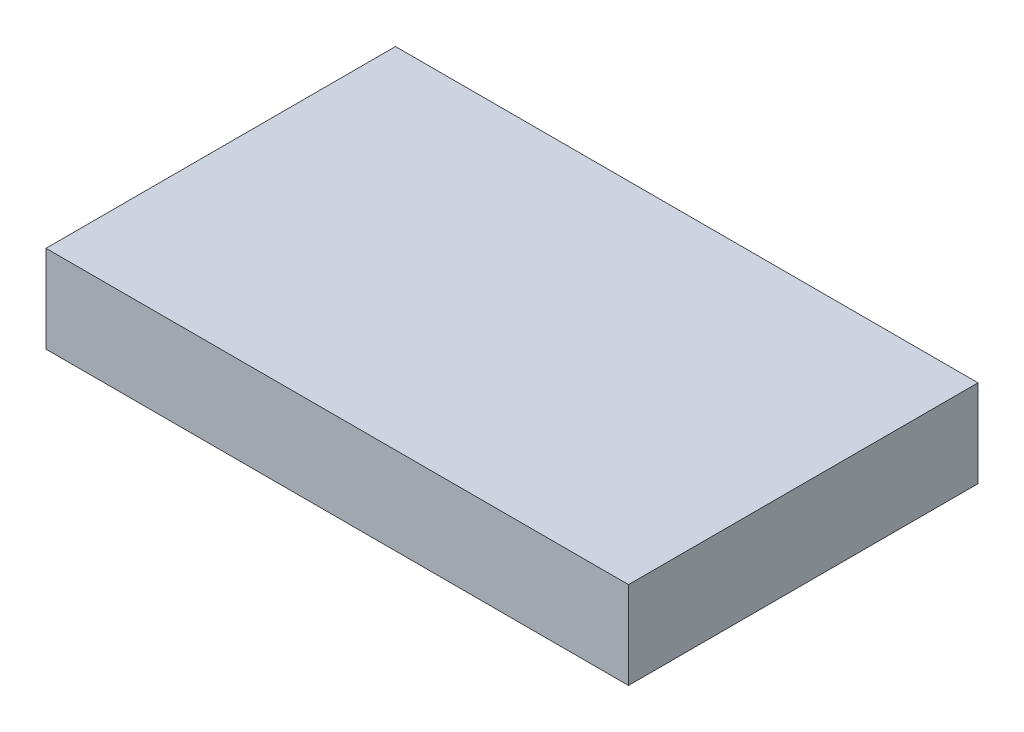
ISO-10303-21;
HEADER;
FILE_DESCRIPTION(('STEP AP214'),'2;1');
FILE_NAME('part.step','',(''),(''),'','','');
FILE_SCHEMA(('AUTOMOTIVE_DESIGN { 1 0 10303 214 1 1 1 1 }'));
ENDSEC;
DATA;
#1=APPLICATION_CONTEXT('core data for automotive mechanical design processes');
#2=APPLICATION_PROTOCOL_DEFINITION('international standard','automotive_design',2000,#1);
#3=PRODUCT_CONTEXT('',#1,'mechanical');
#4=PRODUCT('Part','Part','',(#3));
#5=PRODUCT_RELATED_PRODUCT_CATEGORY('part','',(#4));
#6=PRODUCT_DEFINITION_FORMATION('','',#4);
#7=PRODUCT_DEFINITION_CONTEXT('part definition',#1,'design');
#8=PRODUCT_DEFINITION('design','',#6,#7);
#9=PRODUCT_DEFINITION_SHAPE('','',#8);
#10=(LENGTH_UNIT() NAMED_UNIT(*) SI_UNIT(.MILLI.,.METRE.));
#11=(NAMED_UNIT(*) PLANE_ANGLE_UNIT() SI_UNIT($,.RADIAN.));
#12=(NAMED_UNIT(*) SI_UNIT($,.STERADIAN.) SOLID_ANGLE_UNIT());
#13=UNCERTAINTY_MEASURE_WITH_UNIT(LENGTH_MEASURE(1.E-05),#10,'distance_accuracy_value','');
#14=(GEOMETRIC_REPRESENTATION_CONTEXT(3) GLOBAL_UNCERTAINTY_ASSIGNED_CONTEXT((#13)) GLOBAL_UNIT_ASSIGNED_CONTEXT((#10,
#11,#12)) REPRESENTATION_CONTEXT('',''));
#15=CARTESIAN_POINT('',(0.,0.,0.));
#16=DIRECTION('',(0.,0.,1.));
#17=DIRECTION('',(1.,0.,0.));
#18=AXIS2_PLACEMENT_3D('',#15,#16,#17);
#19=CARTESIAN_POINT('',(-40.,12.,48.));
#20=DIRECTION('',(1.,0.,0.));
#21=DIRECTION('',(0.,0.,-1.));
#22=AXIS2_PLACEMENT_3D('',#19,#20,#21);
#23=PLANE('',#22);
#24=DIRECTION('',(0.,-1.,0.));
#25=VECTOR('',#24,1.);
#26=CARTESIAN_POINT('',(-40.,12.,0.));
#27=LINE('',#26,#25);
#28=CARTESIAN_POINT('',(-40.,12.,0.));
#29=VERTEX_POINT('',#28);
#30=CARTESIAN_POINT('',(-40.,0.,0.));
#31=VERTEX_POINT('',#30);
#32=EDGE_CURVE('E107',#29,#31,#27,.T.);
#33=ORIENTED_EDGE('',*,*,#32,.T.);
#34=DIRECTION('',(0.,0.,-1.));
#35=VECTOR('',#34,1.);
#36=CARTESIAN_POINT('',(-40.,0.,48.));
#37=LINE('',#36,#35);
#38=CARTESIAN_POINT('',(-40.,0.,48.));
#39=VERTEX_POINT('',#38);
#40=EDGE_CURVE('E11',#39,#31,#37,.T.);
#41=ORIENTED_EDGE('',*,*,#40,.F.);
#42=DIRECTION('',(0.,-1.,0.));
#43=VECTOR('',#42,1.);
#44=CARTESIAN_POINT('',(-40.,12.,48.));
#45=LINE('',#44,#43);
#46=CARTESIAN_POINT('',(-40.,12.,48.));
#47=VERTEX_POINT('',#46);
#48=EDGE_CURVE('E91',#47,#39,#45,.T.);
#49=ORIENTED_EDGE('',*,*,#48,.F.);
#50=DIRECTION('',(0.,0.,-1.));
#51=VECTOR('',#50,1.);
#52=CARTESIAN_POINT('',(-40.,12.,48.));
#53=LINE('',#52,#51);
#54=EDGE_CURVE('E103',#47,#29,#53,.T.);
#55=ORIENTED_EDGE('',*,*,#54,.T.);
#56=EDGE_LOOP('',(#33,#41,#49,#55));
#57=FACE_BOUND('',#56,.T.);
#58=ADVANCED_FACE('F39',(#57),#23,.F.);
#59=CARTESIAN_POINT('',(-40.,0.,48.));
#60=DIRECTION('',(0.,1.,0.));
#61=DIRECTION('',(0.,0.,1.));
#62=AXIS2_PLACEMENT_3D('',#59,#60,#61);
#63=PLANE('',#62);
#64=DIRECTION('',(1.,0.,0.));
#65=VECTOR('',#64,1.);
#66=CARTESIAN_POINT('',(-40.,0.,0.));
#67=LINE('',#66,#65);
#68=CARTESIAN_POINT('',(40.,0.,0.));
#69=VERTEX_POINT('',#68);
#70=EDGE_CURVE('E96',#31,#69,#67,.T.);
#71=ORIENTED_EDGE('',*,*,#70,.T.);
#72=DIRECTION('',(0.,0.,-1.));
#73=VECTOR('',#72,1.);
#74=CARTESIAN_POINT('',(40.,0.,48.));
#75=LINE('',#74,#73);
#76=CARTESIAN_POINT('',(40.,0.,48.));
#77=VERTEX_POINT('',#76);
#78=EDGE_CURVE('E48',#77,#69,#75,.T.);
#79=ORIENTED_EDGE('',*,*,#78,.F.);
#80=DIRECTION('',(1.,0.,0.));
#81=VECTOR('',#80,1.);
#82=CARTESIAN_POINT('',(-40.,0.,48.));
#83=LINE('',#82,#81);
#84=EDGE_CURVE('E86',#39,#77,#83,.T.);
#85=ORIENTED_EDGE('',*,*,#84,.F.);
#86=ORIENTED_EDGE('',*,*,#40,.T.);
#87=EDGE_LOOP('',(#71,#79,#85,#86));
#88=FACE_BOUND('',#87,.T.);
#89=ADVANCED_FACE('F95',(#88),#63,.F.);
#90=CARTESIAN_POINT('',(40.,0.,48.));
#91=DIRECTION('',(-1.,0.,0.));
#92=DIRECTION('',(0.,0.,1.));
#93=AXIS2_PLACEMENT_3D('',#90,#91,#92);
#94=PLANE('',#93);
#95=DIRECTION('',(0.,1.,0.));
#96=VECTOR('',#95,1.);
#97=CARTESIAN_POINT('',(40.,0.,0.));
#98=LINE('',#97,#96);
#99=CARTESIAN_POINT('',(40.,12.,0.));
#100=VERTEX_POINT('',#99);
#101=EDGE_CURVE('E73',#69,#100,#98,.T.);
#102=ORIENTED_EDGE('',*,*,#101,.T.);
#103=DIRECTION('',(0.,0.,-1.));
#104=VECTOR('',#103,1.);
#105=CARTESIAN_POINT('',(40.,12.,48.));
#106=LINE('',#105,#104);
#107=CARTESIAN_POINT('',(40.,12.,48.));
#108=VERTEX_POINT('',#107);
#109=EDGE_CURVE('E98',#108,#100,#106,.T.);
#110=ORIENTED_EDGE('',*,*,#109,.F.);
#111=DIRECTION('',(0.,1.,0.));
#112=VECTOR('',#111,1.);
#113=CARTESIAN_POINT('',(40.,0.,48.));
#114=LINE('',#113,#112);
#115=EDGE_CURVE('E89',#77,#108,#114,.T.);
#116=ORIENTED_EDGE('',*,*,#115,.F.);
#117=ORIENTED_EDGE('',*,*,#78,.T.);
#118=EDGE_LOOP('',(#102,#110,#116,#117));
#119=FACE_BOUND('',#118,.T.);
#120=ADVANCED_FACE('F99',(#119),#94,.F.);
#121=CARTESIAN_POINT('',(40.,12.,48.));
#122=DIRECTION('',(0.,-1.,0.));
#123=DIRECTION('',(1.,0.,0.));
#124=AXIS2_PLACEMENT_3D('',#121,#122,#123);
#125=PLANE('',#124);
#126=DIRECTION('',(-1.,0.,0.));
#127=VECTOR('',#126,1.);
#128=CARTESIAN_POINT('',(40.,12.,0.));
#129=LINE('',#128,#127);
#130=EDGE_CURVE('E79',#100,#29,#129,.T.);
#131=ORIENTED_EDGE('',*,*,#130,.T.);
#132=ORIENTED_EDGE('',*,*,#54,.F.);
#133=DIRECTION('',(-1.,0.,0.));
#134=VECTOR('',#133,1.);
#135=CARTESIAN_POINT('',(40.,12.,48.));
#136=LINE('',#135,#134);
#137=EDGE_CURVE('E56',#108,#47,#136,.T.);
#138=ORIENTED_EDGE('',*,*,#137,.F.);
#139=ORIENTED_EDGE('',*,*,#109,.T.);
#140=EDGE_LOOP('',(#131,#132,#138,#139));
#141=FACE_BOUND('',#140,.T.);
#142=ADVANCED_FACE('F120',(#141),#125,.F.);
#143=CARTESIAN_POINT('',(0.,0.,48.));
#144=DIRECTION('',(0.,0.,1.));
#145=DIRECTION('',(1.,0.,0.));
#146=AXIS2_PLACEMENT_3D('',#143,#144,#145);
#147=PLANE('',#146);
#148=ORIENTED_EDGE('',*,*,#48,.T.);
#149=ORIENTED_EDGE('',*,*,#84,.T.);
#150=ORIENTED_EDGE('',*,*,#115,.T.);
#151=ORIENTED_EDGE('',*,*,#137,.T.);
#152=EDGE_LOOP('',(#148,#149,#150,#151));
#153=FACE_BOUND('',#152,.T.);
#154=ADVANCED_FACE('F87',(#153),#147,.T.);
#155=CARTESIAN_POINT('',(0.,0.,0.));
#156=DIRECTION('',(0.,0.,1.));
#157=DIRECTION('',(1.,0.,0.));
#158=AXIS2_PLACEMENT_3D('',#155,#156,#157);
#159=PLANE('',#158);
#160=ORIENTED_EDGE('',*,*,#32,.F.);
#161=ORIENTED_EDGE('',*,*,#130,.F.);
#162=ORIENTED_EDGE('',*,*,#101,.F.);
#163=ORIENTED_EDGE('',*,*,#70,.F.);
#164=EDGE_LOOP('',(#160,#161,#162,#163));
#165=FACE_BOUND('',#164,.T.);
#166=ADVANCED_FACE('F123',(#165),#159,.F.);
#167=CLOSED_SHELL('',(#58,#89,#120,#142,#154,#166));
#168=MANIFOLD_SOLID_BREP('B2',#167);
#169=ADVANCED_BREP_SHAPE_REPRESENTATION('',(#18,#168),#14);
#170=SHAPE_DEFINITION_REPRESENTATION(#9,#169);
ENDSEC;
END-ISO-10303-21;
